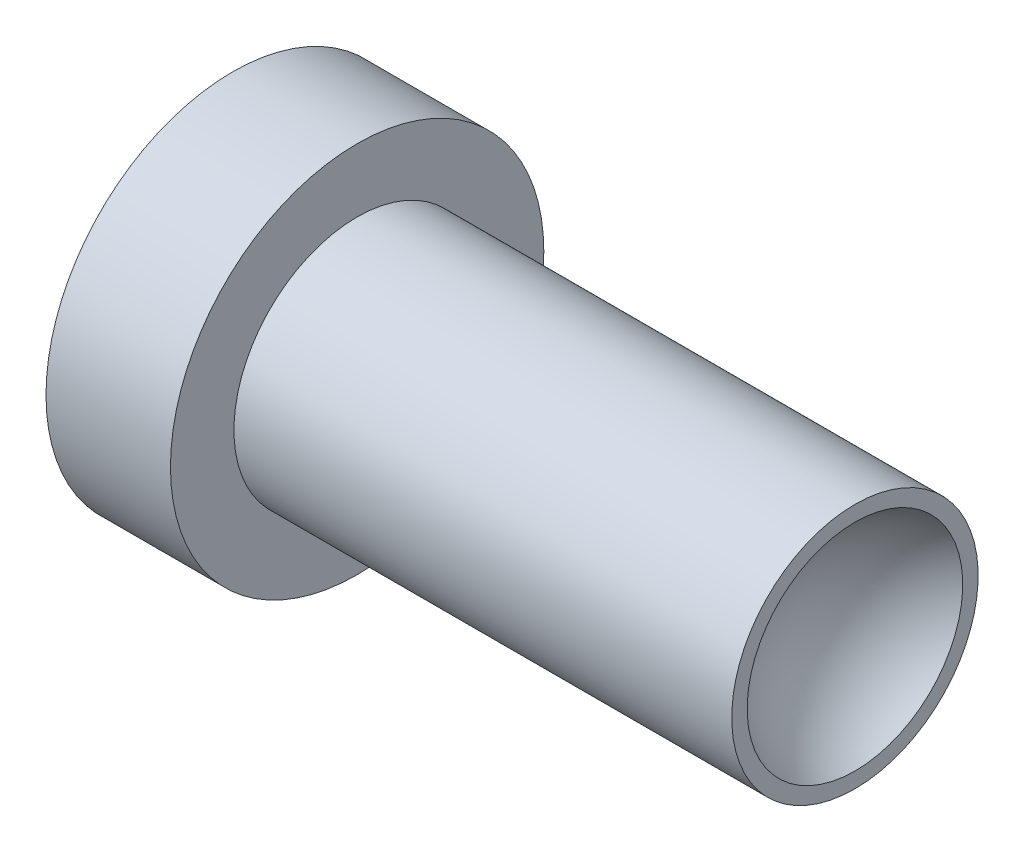
ISO-10303-21;
HEADER;
FILE_DESCRIPTION(('STEP AP214'),'2;1');
FILE_NAME('part.step','',(''),(''),'','','');
FILE_SCHEMA(('AUTOMOTIVE_DESIGN { 1 0 10303 214 1 1 1 1 }'));
ENDSEC;
DATA;
#1=APPLICATION_CONTEXT('core data for automotive mechanical design processes');
#2=APPLICATION_PROTOCOL_DEFINITION('international standard','automotive_design',2000,#1);
#3=PRODUCT_CONTEXT('',#1,'mechanical');
#4=PRODUCT('Part','Part','',(#3));
#5=PRODUCT_RELATED_PRODUCT_CATEGORY('part','',(#4));
#6=PRODUCT_DEFINITION_FORMATION('','',#4);
#7=PRODUCT_DEFINITION_CONTEXT('part definition',#1,'design');
#8=PRODUCT_DEFINITION('design','',#6,#7);
#9=PRODUCT_DEFINITION_SHAPE('','',#8);
#10=(LENGTH_UNIT() NAMED_UNIT(*) SI_UNIT(.MILLI.,.METRE.));
#11=(NAMED_UNIT(*) PLANE_ANGLE_UNIT() SI_UNIT($,.RADIAN.));
#12=(NAMED_UNIT(*) SI_UNIT($,.STERADIAN.) SOLID_ANGLE_UNIT());
#13=UNCERTAINTY_MEASURE_WITH_UNIT(LENGTH_MEASURE(1.E-05),#10,'distance_accuracy_value','');
#14=(GEOMETRIC_REPRESENTATION_CONTEXT(3) GLOBAL_UNCERTAINTY_ASSIGNED_CONTEXT((#13)) GLOBAL_UNIT_ASSIGNED_CONTEXT((#10,
#11,#12)) REPRESENTATION_CONTEXT('',''));
#15=CARTESIAN_POINT('',(0.,0.,0.));
#16=DIRECTION('',(0.,0.,1.));
#17=DIRECTION('',(1.,0.,0.));
#18=AXIS2_PLACEMENT_3D('',#15,#16,#17);
#19=CARTESIAN_POINT('',(0.,0.,0.));
#20=DIRECTION('',(-1.,0.,0.));
#21=DIRECTION('',(0.,-1.,0.));
#22=AXIS2_PLACEMENT_3D('',#19,#20,#21);
#23=PLANE('',#22);
#24=CARTESIAN_POINT('',(0.,0.,0.));
#25=DIRECTION('',(1.,0.,0.));
#26=DIRECTION('',(0.,1.,0.));
#27=AXIS2_PLACEMENT_3D('',#24,#25,#26);
#28=CIRCLE('',#27,19.05);
#29=CARTESIAN_POINT('',(0.,19.05,0.));
#30=VERTEX_POINT('',#29);
#31=EDGE_CURVE('E10',#30,#30,#28,.T.);
#32=ORIENTED_EDGE('',*,*,#31,.F.);
#33=EDGE_LOOP('',(#32));
#34=FACE_BOUND('',#33,.T.);
#35=ADVANCED_FACE('F43',(#34),#23,.T.);
#36=CARTESIAN_POINT('',(63.5,0.,0.));
#37=DIRECTION('',(1.,0.,0.));
#38=DIRECTION('',(0.,1.,0.));
#39=AXIS2_PLACEMENT_3D('',#36,#37,#38);
#40=CYLINDRICAL_SURFACE('',#39,19.05);
#41=ORIENTED_EDGE('',*,*,#31,.T.);
#42=EDGE_LOOP('',(#41));
#43=FACE_BOUND('',#42,.T.);
#44=CARTESIAN_POINT('',(12.7,0.,0.));
#45=DIRECTION('',(1.,0.,0.));
#46=DIRECTION('',(0.,1.,0.));
#47=AXIS2_PLACEMENT_3D('',#44,#45,#46);
#48=CIRCLE('',#47,19.05);
#49=CARTESIAN_POINT('',(12.7,19.05,0.));
#50=VERTEX_POINT('',#49);
#51=EDGE_CURVE('E50',#50,#50,#48,.T.);
#52=ORIENTED_EDGE('',*,*,#51,.F.);
#53=EDGE_LOOP('',(#52));
#54=FACE_BOUND('',#53,.T.);
#55=ADVANCED_FACE('F87',(#43,#54),#40,.T.);
#56=CARTESIAN_POINT('',(12.7,19.05,0.));
#57=DIRECTION('',(1.,0.,0.));
#58=DIRECTION('',(0.,1.,0.));
#59=AXIS2_PLACEMENT_3D('',#56,#57,#58);
#60=PLANE('',#59);
#61=ORIENTED_EDGE('',*,*,#51,.T.);
#62=EDGE_LOOP('',(#61));
#63=FACE_BOUND('',#62,.T.);
#64=CARTESIAN_POINT('',(12.7,0.,0.));
#65=DIRECTION('',(1.,0.,0.));
#66=DIRECTION('',(0.,1.,0.));
#67=AXIS2_PLACEMENT_3D('',#64,#65,#66);
#68=CIRCLE('',#67,12.573);
#69=CARTESIAN_POINT('',(12.7,12.573,0.));
#70=VERTEX_POINT('',#69);
#71=EDGE_CURVE('E55',#70,#70,#68,.T.);
#72=ORIENTED_EDGE('',*,*,#71,.F.);
#73=EDGE_LOOP('',(#72));
#74=FACE_BOUND('',#73,.T.);
#75=ADVANCED_FACE('F81',(#63,#74),#60,.T.);
#76=CARTESIAN_POINT('',(63.5,0.,0.));
#77=DIRECTION('',(1.,0.,0.));
#78=DIRECTION('',(0.,1.,0.));
#79=AXIS2_PLACEMENT_3D('',#76,#77,#78);
#80=CYLINDRICAL_SURFACE('',#79,12.573);
#81=ORIENTED_EDGE('',*,*,#71,.T.);
#82=EDGE_LOOP('',(#81));
#83=FACE_BOUND('',#82,.T.);
#84=CARTESIAN_POINT('',(63.5,0.,0.));
#85=DIRECTION('',(1.,0.,0.));
#86=DIRECTION('',(0.,1.,0.));
#87=AXIS2_PLACEMENT_3D('',#84,#85,#86);
#88=CIRCLE('',#87,12.573);
#89=CARTESIAN_POINT('',(63.5,12.573,0.));
#90=VERTEX_POINT('',#89);
#91=EDGE_CURVE('E60',#90,#90,#88,.T.);
#92=ORIENTED_EDGE('',*,*,#91,.F.);
#93=EDGE_LOOP('',(#92));
#94=FACE_BOUND('',#93,.T.);
#95=ADVANCED_FACE('F76',(#83,#94),#80,.T.);
#96=CARTESIAN_POINT('',(63.5,12.573,0.));
#97=DIRECTION('',(1.,0.,0.));
#98=DIRECTION('',(0.,1.,0.));
#99=AXIS2_PLACEMENT_3D('',#96,#97,#98);
#100=PLANE('',#99);
#101=CARTESIAN_POINT('',(63.5,0.,0.));
#102=DIRECTION('',(1.,0.,0.));
#103=DIRECTION('',(0.,1.,0.));
#104=AXIS2_PLACEMENT_3D('',#101,#102,#103);
#105=CIRCLE('',#104,10.9985226280624);
#106=CARTESIAN_POINT('',(63.5,10.9985226280624,0.));
#107=VERTEX_POINT('',#106);
#108=EDGE_CURVE('E66',#107,#107,#105,.T.);
#109=ORIENTED_EDGE('',*,*,#108,.F.);
#110=EDGE_LOOP('',(#109));
#111=FACE_BOUND('',#110,.T.);
#112=ORIENTED_EDGE('',*,*,#91,.T.);
#113=EDGE_LOOP('',(#112));
#114=FACE_BOUND('',#113,.T.);
#115=ADVANCED_FACE('F73',(#111,#114),#100,.T.);
#116=CARTESIAN_POINT('',(69.85,0.,0.));
#117=DIRECTION('',(1.,0.,0.));
#118=DIRECTION('',(0.,1.,0.));
#119=AXIS2_PLACEMENT_3D('',#116,#117,#118);
#120=SPHERICAL_SURFACE('',#119,12.7);
#121=ORIENTED_EDGE('',*,*,#108,.T.);
#122=EDGE_LOOP('',(#121));
#123=FACE_BOUND('',#122,.T.);
#124=ADVANCED_FACE('F71',(#123),#120,.F.);
#125=CLOSED_SHELL('',(#35,#55,#75,#95,#115,#124));
#126=MANIFOLD_SOLID_BREP('B2',#125);
#127=ADVANCED_BREP_SHAPE_REPRESENTATION('',(#18,#126),#14);
#128=SHAPE_DEFINITION_REPRESENTATION(#9,#127);
ENDSEC;
END-ISO-10303-21;
